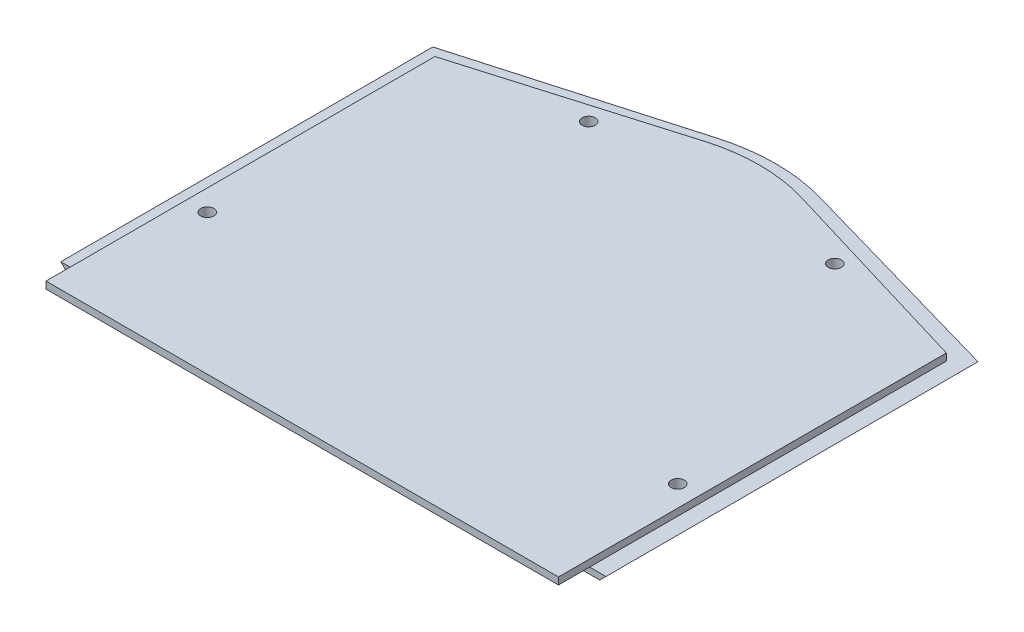
ISO-10303-21;
HEADER;
FILE_DESCRIPTION(('STEP AP214'),'2;1');
FILE_NAME('part.step','',(''),(''),'','','');
FILE_SCHEMA(('AUTOMOTIVE_DESIGN { 1 0 10303 214 1 1 1 1 }'));
ENDSEC;
DATA;
#1=APPLICATION_CONTEXT('core data for automotive mechanical design processes');
#2=APPLICATION_PROTOCOL_DEFINITION('international standard','automotive_design',2000,#1);
#3=PRODUCT_CONTEXT('',#1,'mechanical');
#4=PRODUCT('Part','Part','',(#3));
#5=PRODUCT_RELATED_PRODUCT_CATEGORY('part','',(#4));
#6=PRODUCT_DEFINITION_FORMATION('','',#4);
#7=PRODUCT_DEFINITION_CONTEXT('part definition',#1,'design');
#8=PRODUCT_DEFINITION('design','',#6,#7);
#9=PRODUCT_DEFINITION_SHAPE('','',#8);
#10=(LENGTH_UNIT() NAMED_UNIT(*) SI_UNIT(.MILLI.,.METRE.));
#11=(NAMED_UNIT(*) PLANE_ANGLE_UNIT() SI_UNIT($,.RADIAN.));
#12=(NAMED_UNIT(*) SI_UNIT($,.STERADIAN.) SOLID_ANGLE_UNIT());
#13=UNCERTAINTY_MEASURE_WITH_UNIT(LENGTH_MEASURE(1.E-05),#10,'distance_accuracy_value','');
#14=(GEOMETRIC_REPRESENTATION_CONTEXT(3) GLOBAL_UNCERTAINTY_ASSIGNED_CONTEXT((#13)) GLOBAL_UNIT_ASSIGNED_CONTEXT((#10,
#11,#12)) REPRESENTATION_CONTEXT('',''));
#15=CARTESIAN_POINT('',(0.,0.,0.));
#16=DIRECTION('',(0.,0.,1.));
#17=DIRECTION('',(1.,0.,0.));
#18=AXIS2_PLACEMENT_3D('',#15,#16,#17);
#19=CARTESIAN_POINT('',(-87.51,-2.,-9.99999999999999));
#20=DIRECTION('',(0.,0.,-1.));
#21=DIRECTION('',(0.,1.,0.));
#22=AXIS2_PLACEMENT_3D('',#19,#20,#21);
#23=PLANE('',#22);
#24=DIRECTION('',(0.70710678118654,-0.707106781186555,0.));
#25=VECTOR('',#24,1.);
#26=CARTESIAN_POINT('',(-85.5000000000001,-1.9999999999999,-9.99999999999999));
#27=LINE('',#26,#25);
#28=CARTESIAN_POINT('',(-87.5,0.,-9.99999999999998));
#29=VERTEX_POINT('',#28);
#30=CARTESIAN_POINT('',(-85.5,-2.,-9.99999999999999));
#31=VERTEX_POINT('',#30);
#32=EDGE_CURVE('E151',#29,#31,#27,.T.);
#33=ORIENTED_EDGE('',*,*,#32,.T.);
#34=DIRECTION('',(1.,0.,0.));
#35=VECTOR('',#34,1.);
#36=CARTESIAN_POINT('',(0.,-2.,-9.99999999999999));
#37=LINE('',#36,#35);
#38=CARTESIAN_POINT('',(85.5,-2.,-10.));
#39=VERTEX_POINT('',#38);
#40=EDGE_CURVE('E177',#31,#39,#37,.T.);
#41=ORIENTED_EDGE('',*,*,#40,.T.);
#42=DIRECTION('',(0.707106781186539,0.707106781186556,0.));
#43=VECTOR('',#42,1.);
#44=CARTESIAN_POINT('',(85.5000000000001,-1.9999999999999,-9.99999999999999));
#45=LINE('',#44,#43);
#46=CARTESIAN_POINT('',(87.5,0.,-9.99999999999999));
#47=VERTEX_POINT('',#46);
#48=EDGE_CURVE('E62',#39,#47,#45,.T.);
#49=ORIENTED_EDGE('',*,*,#48,.T.);
#50=DIRECTION('',(1.,0.,0.));
#51=VECTOR('',#50,1.);
#52=CARTESIAN_POINT('',(-87.51,0.,-10.));
#53=LINE('',#52,#51);
#54=CARTESIAN_POINT('',(82.2500000000001,0.,-9.99999999999995));
#55=VERTEX_POINT('',#54);
#56=EDGE_CURVE('E55',#55,#47,#53,.T.);
#57=ORIENTED_EDGE('',*,*,#56,.F.);
#58=CARTESIAN_POINT('',(-82.25,0.,-9.99999999999999));
#59=VERTEX_POINT('',#58);
#60=EDGE_CURVE('E191',#59,#55,#53,.T.);
#61=ORIENTED_EDGE('',*,*,#60,.F.);
#62=EDGE_CURVE('E185',#29,#59,#53,.T.);
#63=ORIENTED_EDGE('',*,*,#62,.F.);
#64=EDGE_LOOP('',(#33,#41,#49,#57,#61,#63));
#65=FACE_BOUND('',#64,.T.);
#66=ADVANCED_FACE('F39',(#65),#23,.F.);
#67=CARTESIAN_POINT('',(-87.51,0.,-10.));
#68=DIRECTION('',(0.,1.,0.));
#69=DIRECTION('',(0.,0.,1.));
#70=AXIS2_PLACEMENT_3D('',#67,#68,#69);
#71=PLANE('',#70);
#72=CARTESIAN_POINT('',(-72.2500000000001,0.,-4.99999999999995));
#73=DIRECTION('',(0.,1.,0.));
#74=DIRECTION('',(0.,0.,1.));
#75=AXIS2_PLACEMENT_3D('',#72,#73,#74);
#76=CIRCLE('',#75,2.25);
#77=CARTESIAN_POINT('',(-72.2500000000001,0.,-2.74999999999995));
#78=VERTEX_POINT('',#77);
#79=EDGE_CURVE('E205',#78,#78,#76,.F.);
#80=ORIENTED_EDGE('',*,*,#79,.F.);
#81=EDGE_LOOP('',(#80));
#82=FACE_BOUND('',#81,.T.);
#83=CARTESIAN_POINT('',(72.2500000000001,0.,-4.99999999999995));
#84=DIRECTION('',(0.,1.,0.));
#85=DIRECTION('',(0.,0.,1.));
#86=AXIS2_PLACEMENT_3D('',#83,#84,#85);
#87=CIRCLE('',#86,2.25);
#88=CARTESIAN_POINT('',(72.2500000000001,0.,-2.74999999999995));
#89=VERTEX_POINT('',#88);
#90=EDGE_CURVE('E190',#89,#89,#87,.F.);
#91=ORIENTED_EDGE('',*,*,#90,.F.);
#92=EDGE_LOOP('',(#91));
#93=FACE_BOUND('',#92,.T.);
#94=DIRECTION('',(0.,0.,-1.));
#95=VECTOR('',#94,1.);
#96=CARTESIAN_POINT('',(-82.25,0.,-124.813107271121));
#97=LINE('',#96,#95);
#98=CARTESIAN_POINT('',(-82.25,0.,0.));
#99=VERTEX_POINT('',#98);
#100=EDGE_CURVE('E491',#99,#59,#97,.T.);
#101=ORIENTED_EDGE('',*,*,#100,.T.);
#102=ORIENTED_EDGE('',*,*,#60,.T.);
#103=DIRECTION('',(0.,0.,1.));
#104=VECTOR('',#103,1.);
#105=CARTESIAN_POINT('',(82.25,0.,140.));
#106=LINE('',#105,#104);
#107=CARTESIAN_POINT('',(82.2500000000001,0.,0.));
#108=VERTEX_POINT('',#107);
#109=EDGE_CURVE('E176',#55,#108,#106,.T.);
#110=ORIENTED_EDGE('',*,*,#109,.T.);
#111=DIRECTION('',(1.,0.,0.));
#112=VECTOR('',#111,1.);
#113=CARTESIAN_POINT('',(-87.51,0.,0.));
#114=LINE('',#113,#112);
#115=EDGE_CURVE('E186',#99,#108,#114,.T.);
#116=ORIENTED_EDGE('',*,*,#115,.F.);
#117=EDGE_LOOP('',(#101,#102,#110,#116));
#118=FACE_BOUND('',#117,.T.);
#119=ADVANCED_FACE('F232',(#82,#93,#118),#71,.F.);
#120=CARTESIAN_POINT('',(-87.51,0.,0.));
#121=DIRECTION('',(0.,0.,-1.));
#122=DIRECTION('',(0.,1.,0.));
#123=AXIS2_PLACEMENT_3D('',#120,#121,#122);
#124=PLANE('',#123);
#125=DIRECTION('',(0.,1.,0.));
#126=VECTOR('',#125,1.);
#127=CARTESIAN_POINT('',(82.2500000000001,2.24999999999914,0.));
#128=LINE('',#127,#126);
#129=CARTESIAN_POINT('',(82.2500000000001,2.25,0.));
#130=VERTEX_POINT('',#129);
#131=EDGE_CURVE('E184',#108,#130,#128,.T.);
#132=ORIENTED_EDGE('',*,*,#131,.T.);
#133=DIRECTION('',(1.,0.,0.));
#134=VECTOR('',#133,1.);
#135=CARTESIAN_POINT('',(-0.000440445540175055,2.25,0.));
#136=LINE('',#135,#134);
#137=CARTESIAN_POINT('',(-82.25,2.25,0.));
#138=VERTEX_POINT('',#137);
#139=EDGE_CURVE('E181',#138,#130,#136,.T.);
#140=ORIENTED_EDGE('',*,*,#139,.F.);
#141=DIRECTION('',(0.,-1.,0.));
#142=VECTOR('',#141,1.);
#143=CARTESIAN_POINT('',(-82.25,2.25000000000077,0.));
#144=LINE('',#143,#142);
#145=EDGE_CURVE('E180',#138,#99,#144,.T.);
#146=ORIENTED_EDGE('',*,*,#145,.T.);
#147=ORIENTED_EDGE('',*,*,#115,.T.);
#148=EDGE_LOOP('',(#132,#140,#146,#147));
#149=FACE_BOUND('',#148,.T.);
#150=ADVANCED_FACE('F238',(#149),#124,.F.);
#151=CARTESIAN_POINT('',(-0.000440445540175055,2.25,-91.9949855904792));
#152=DIRECTION('',(0.,-1.,0.));
#153=DIRECTION('',(0.,0.,-1.));
#154=AXIS2_PLACEMENT_3D('',#151,#152,#153);
#155=PLANE('',#154);
#156=CARTESIAN_POINT('',(75.5,2.25,-45.018802153517));
#157=DIRECTION('',(0.,-1.,0.));
#158=DIRECTION('',(0.,0.,-1.));
#159=AXIS2_PLACEMENT_3D('',#156,#157,#158);
#160=CIRCLE('',#159,2.1);
#161=CARTESIAN_POINT('',(75.5,2.25,-47.118802153517));
#162=VERTEX_POINT('',#161);
#163=EDGE_CURVE('E618',#162,#162,#160,.F.);
#164=ORIENTED_EDGE('',*,*,#163,.F.);
#165=EDGE_LOOP('',(#164));
#166=FACE_BOUND('',#165,.T.);
#167=CARTESIAN_POINT('',(-75.5,2.25,-45.018802153517));
#168=DIRECTION('',(0.,-1.,0.));
#169=DIRECTION('',(0.,0.,-1.));
#170=AXIS2_PLACEMENT_3D('',#167,#168,#169);
#171=CIRCLE('',#170,2.1);
#172=CARTESIAN_POINT('',(-75.5,2.25,-47.118802153517));
#173=VERTEX_POINT('',#172);
#174=EDGE_CURVE('E626',#173,#173,#171,.F.);
#175=ORIENTED_EDGE('',*,*,#174,.F.);
#176=EDGE_LOOP('',(#175));
#177=FACE_BOUND('',#176,.T.);
#178=CARTESIAN_POINT('',(-39.4999999999999,2.25,-131.431881025172));
#179=DIRECTION('',(0.,-1.,0.));
#180=DIRECTION('',(0.,0.,-1.));
#181=AXIS2_PLACEMENT_3D('',#178,#179,#180);
#182=CIRCLE('',#181,2.09999999999999);
#183=CARTESIAN_POINT('',(-39.4999999999999,2.25,-133.531881025172));
#184=VERTEX_POINT('',#183);
#185=EDGE_CURVE('E627',#184,#184,#182,.F.);
#186=ORIENTED_EDGE('',*,*,#185,.F.);
#187=EDGE_LOOP('',(#186));
#188=FACE_BOUND('',#187,.T.);
#189=CARTESIAN_POINT('',(39.4999999999999,2.25,-131.431881025172));
#190=DIRECTION('',(0.,-1.,0.));
#191=DIRECTION('',(0.,0.,-1.));
#192=AXIS2_PLACEMENT_3D('',#189,#190,#191);
#193=CIRCLE('',#192,2.09999999999999);
#194=CARTESIAN_POINT('',(39.4999999999999,2.25,-133.531881025172));
#195=VERTEX_POINT('',#194);
#196=EDGE_CURVE('E562',#195,#195,#193,.F.);
#197=ORIENTED_EDGE('',*,*,#196,.F.);
#198=EDGE_LOOP('',(#197));
#199=FACE_BOUND('',#198,.T.);
#200=DIRECTION('',(0.,0.,-1.));
#201=VECTOR('',#200,1.);
#202=CARTESIAN_POINT('',(-82.25,2.25,-124.813107271121));
#203=LINE('',#202,#201);
#204=CARTESIAN_POINT('',(-82.25,2.25,-124.813107271121));
#205=VERTEX_POINT('',#204);
#206=EDGE_CURVE('E529',#138,#205,#203,.T.);
#207=ORIENTED_EDGE('',*,*,#206,.F.);
#208=ORIENTED_EDGE('',*,*,#139,.T.);
#209=DIRECTION('',(0.,0.,1.));
#210=VECTOR('',#209,1.);
#211=CARTESIAN_POINT('',(82.25,2.25,140.));
#212=LINE('',#211,#210);
#213=CARTESIAN_POINT('',(82.2500000000001,2.25,-124.502754063605));
#214=VERTEX_POINT('',#213);
#215=EDGE_CURVE('E512',#214,#130,#212,.T.);
#216=ORIENTED_EDGE('',*,*,#215,.F.);
#217=DIRECTION('',(0.957804935689602,0.,0.287419041068329));
#218=VECTOR('',#217,1.);
#219=CARTESIAN_POINT('',(82.2500000000001,2.25,-124.502754063605));
#220=LINE('',#219,#218);
#221=CARTESIAN_POINT('',(15.1801210419452,2.25,-144.629148881997));
#222=VERTEX_POINT('',#221);
#223=EDGE_CURVE('E588',#222,#214,#220,.T.);
#224=ORIENTED_EDGE('',*,*,#223,.F.);
#225=CARTESIAN_POINT('',(0.0927899102311189,2.25,-91.9949855904792));
#226=DIRECTION('',(0.,-1.,0.));
#227=DIRECTION('',(0.,0.,-1.));
#228=AXIS2_PLACEMENT_3D('',#225,#226,#227);
#229=CIRCLE('',#228,54.7538373639337);
#230=CARTESIAN_POINT('',(0.0461747323373077,2.25,-146.748803111281));
#231=VERTEX_POINT('',#230);
#232=EDGE_CURVE('E585',#231,#222,#229,.T.);
#233=ORIENTED_EDGE('',*,*,#232,.F.);
#234=CARTESIAN_POINT('',(-0.000440445540175055,2.25,-91.9949855904792));
#235=DIRECTION('',(0.,-1.,0.));
#236=DIRECTION('',(0.,0.,-1.));
#237=AXIS2_PLACEMENT_3D('',#234,#235,#236);
#238=CIRCLE('',#237,54.7538373639337);
#239=CARTESIAN_POINT('',(-15.0877715772482,2.25,-144.629148881998));
#240=VERTEX_POINT('',#239);
#241=EDGE_CURVE('E581',#240,#231,#238,.T.);
#242=ORIENTED_EDGE('',*,*,#241,.F.);
#243=DIRECTION('',(0.959123750848793,0.,-0.282986979484468));
#244=VECTOR('',#243,1.);
#245=CARTESIAN_POINT('',(-15.0877715772482,2.25,-144.629148881998));
#246=LINE('',#245,#244);
#247=EDGE_CURVE('E577',#205,#240,#246,.T.);
#248=ORIENTED_EDGE('',*,*,#247,.F.);
#249=EDGE_LOOP('',(#207,#208,#216,#224,#233,#242,#248));
#250=FACE_BOUND('',#249,.T.);
#251=ADVANCED_FACE('F244',(#166,#177,#188,#199,#250),#155,.F.);
#252=CARTESIAN_POINT('',(82.25,2.25,140.));
#253=DIRECTION('',(1.,0.,0.));
#254=DIRECTION('',(0.,0.,-1.));
#255=AXIS2_PLACEMENT_3D('',#252,#253,#254);
#256=PLANE('',#255);
#257=ORIENTED_EDGE('',*,*,#131,.F.);
#258=ORIENTED_EDGE('',*,*,#109,.F.);
#259=CARTESIAN_POINT('',(82.2500000000001,0.,-124.502754063605));
#260=VERTEX_POINT('',#259);
#261=EDGE_CURVE('E526',#260,#55,#106,.T.);
#262=ORIENTED_EDGE('',*,*,#261,.F.);
#263=DIRECTION('',(0.,-1.,0.));
#264=VECTOR('',#263,1.);
#265=CARTESIAN_POINT('',(82.2500000000001,2.25,-124.502754063605));
#266=LINE('',#265,#264);
#267=EDGE_CURVE('E530',#214,#260,#266,.T.);
#268=ORIENTED_EDGE('',*,*,#267,.F.);
#269=ORIENTED_EDGE('',*,*,#215,.T.);
#270=EDGE_LOOP('',(#257,#258,#262,#268,#269));
#271=FACE_BOUND('',#270,.T.);
#272=ADVANCED_FACE('F284',(#271),#256,.T.);
#273=CARTESIAN_POINT('',(82.2500000000001,2.25,-124.502754063605));
#274=DIRECTION('',(0.287419041068329,0.,-0.957804935689602));
#275=DIRECTION('',(-0.957804935689602,0.,-0.287419041068329));
#276=AXIS2_PLACEMENT_3D('',#273,#274,#275);
#277=PLANE('',#276);
#278=DIRECTION('',(0.957804935689602,0.,0.287419041068329));
#279=VECTOR('',#278,1.);
#280=CARTESIAN_POINT('',(82.2500000000001,0.,-124.502754063605));
#281=LINE('',#280,#279);
#282=CARTESIAN_POINT('',(15.1801210419452,0.,-144.629148881997));
#283=VERTEX_POINT('',#282);
#284=EDGE_CURVE('E522',#283,#260,#281,.T.);
#285=ORIENTED_EDGE('',*,*,#284,.F.);
#286=DIRECTION('',(0.,-1.,0.));
#287=VECTOR('',#286,1.);
#288=CARTESIAN_POINT('',(15.1801210419452,2.25,-144.629148881997));
#289=LINE('',#288,#287);
#290=EDGE_CURVE('E534',#222,#283,#289,.T.);
#291=ORIENTED_EDGE('',*,*,#290,.F.);
#292=ORIENTED_EDGE('',*,*,#223,.T.);
#293=ORIENTED_EDGE('',*,*,#267,.T.);
#294=EDGE_LOOP('',(#285,#291,#292,#293));
#295=FACE_BOUND('',#294,.T.);
#296=ADVANCED_FACE('F280',(#295),#277,.T.);
#297=CARTESIAN_POINT('',(0.0927899102311189,2.25,-91.9949855904792));
#298=DIRECTION('',(0.,-1.,0.));
#299=DIRECTION('',(0.,0.,-1.));
#300=AXIS2_PLACEMENT_3D('',#297,#298,#299);
#301=CYLINDRICAL_SURFACE('',#300,54.7538373639337);
#302=CARTESIAN_POINT('',(0.0927899102311189,0.,-91.9949855904792));
#303=DIRECTION('',(0.,-1.,0.));
#304=DIRECTION('',(0.,0.,-1.));
#305=AXIS2_PLACEMENT_3D('',#302,#303,#304);
#306=CIRCLE('',#305,54.7538373639337);
#307=CARTESIAN_POINT('',(0.0461747323373077,0.,-146.748803111281));
#308=VERTEX_POINT('',#307);
#309=EDGE_CURVE('E518',#308,#283,#306,.T.);
#310=ORIENTED_EDGE('',*,*,#309,.F.);
#311=DIRECTION('',(0.,-1.,0.));
#312=VECTOR('',#311,1.);
#313=CARTESIAN_POINT('',(0.0461747323373077,2.25,-146.748803111281));
#314=LINE('',#313,#312);
#315=EDGE_CURVE('E537',#231,#308,#314,.T.);
#316=ORIENTED_EDGE('',*,*,#315,.F.);
#317=ORIENTED_EDGE('',*,*,#232,.T.);
#318=ORIENTED_EDGE('',*,*,#290,.T.);
#319=EDGE_LOOP('',(#310,#316,#317,#318));
#320=FACE_BOUND('',#319,.T.);
#321=ADVANCED_FACE('F276',(#320),#301,.T.);
#322=CARTESIAN_POINT('',(-0.000440445540175055,2.25,-91.9949855904792));
#323=DIRECTION('',(0.,-1.,0.));
#324=DIRECTION('',(0.,0.,-1.));
#325=AXIS2_PLACEMENT_3D('',#322,#323,#324);
#326=CYLINDRICAL_SURFACE('',#325,54.7538373639337);
#327=CARTESIAN_POINT('',(-0.000440445540175055,0.,-91.9949855904792));
#328=DIRECTION('',(0.,-1.,0.));
#329=DIRECTION('',(0.,0.,-1.));
#330=AXIS2_PLACEMENT_3D('',#327,#328,#329);
#331=CIRCLE('',#330,54.7538373639337);
#332=CARTESIAN_POINT('',(-15.0877715772482,0.,-144.629148881998));
#333=VERTEX_POINT('',#332);
#334=EDGE_CURVE('E507',#333,#308,#331,.T.);
#335=ORIENTED_EDGE('',*,*,#334,.F.);
#336=DIRECTION('',(0.,-1.,0.));
#337=VECTOR('',#336,1.);
#338=CARTESIAN_POINT('',(-15.0877715772482,2.25,-144.629148881998));
#339=LINE('',#338,#337);
#340=EDGE_CURVE('E540',#240,#333,#339,.T.);
#341=ORIENTED_EDGE('',*,*,#340,.F.);
#342=ORIENTED_EDGE('',*,*,#241,.T.);
#343=ORIENTED_EDGE('',*,*,#315,.T.);
#344=EDGE_LOOP('',(#335,#341,#342,#343));
#345=FACE_BOUND('',#344,.T.);
#346=ADVANCED_FACE('F272',(#345),#326,.T.);
#347=CARTESIAN_POINT('',(-15.0877715772482,2.25,-144.629148881998));
#348=DIRECTION('',(-0.282986979484468,0.,-0.959123750848793));
#349=DIRECTION('',(-0.959123750848793,0.,0.282986979484468));
#350=AXIS2_PLACEMENT_3D('',#347,#348,#349);
#351=PLANE('',#350);
#352=DIRECTION('',(0.959123750848793,0.,-0.282986979484468));
#353=VECTOR('',#352,1.);
#354=CARTESIAN_POINT('',(-15.0877715772482,0.,-144.629148881998));
#355=LINE('',#354,#353);
#356=CARTESIAN_POINT('',(-82.25,0.,-124.813107271121));
#357=VERTEX_POINT('',#356);
#358=EDGE_CURVE('E503',#357,#333,#355,.T.);
#359=ORIENTED_EDGE('',*,*,#358,.F.);
#360=DIRECTION('',(0.,-1.,0.));
#361=VECTOR('',#360,1.);
#362=CARTESIAN_POINT('',(-82.25,2.25,-124.813107271121));
#363=LINE('',#362,#361);
#364=EDGE_CURVE('E499',#205,#357,#363,.T.);
#365=ORIENTED_EDGE('',*,*,#364,.F.);
#366=ORIENTED_EDGE('',*,*,#247,.T.);
#367=ORIENTED_EDGE('',*,*,#340,.T.);
#368=EDGE_LOOP('',(#359,#365,#366,#367));
#369=FACE_BOUND('',#368,.T.);
#370=ADVANCED_FACE('F268',(#369),#351,.T.);
#371=CARTESIAN_POINT('',(-82.25,2.25,-124.813107271121));
#372=DIRECTION('',(-1.,0.,0.));
#373=DIRECTION('',(0.,0.,1.));
#374=AXIS2_PLACEMENT_3D('',#371,#372,#373);
#375=PLANE('',#374);
#376=ORIENTED_EDGE('',*,*,#145,.F.);
#377=ORIENTED_EDGE('',*,*,#206,.T.);
#378=ORIENTED_EDGE('',*,*,#364,.T.);
#379=EDGE_CURVE('E496',#59,#357,#97,.T.);
#380=ORIENTED_EDGE('',*,*,#379,.F.);
#381=ORIENTED_EDGE('',*,*,#100,.F.);
#382=EDGE_LOOP('',(#376,#377,#378,#380,#381));
#383=FACE_BOUND('',#382,.T.);
#384=ADVANCED_FACE('F264',(#383),#375,.T.);
#385=CARTESIAN_POINT('',(39.4999999999999,2.251,-131.431881025172));
#386=DIRECTION('',(0.,-1.,0.));
#387=DIRECTION('',(0.,0.,-1.));
#388=AXIS2_PLACEMENT_3D('',#385,#386,#387);
#389=CYLINDRICAL_SURFACE('',#388,2.09999999999999);
#390=CARTESIAN_POINT('',(39.4999999999999,-2.,-131.431881025172));
#391=DIRECTION('',(0.,-1.,0.));
#392=DIRECTION('',(0.,0.,-1.));
#393=AXIS2_PLACEMENT_3D('',#390,#391,#392);
#394=CIRCLE('',#393,2.09999999999999);
#395=CARTESIAN_POINT('',(39.4999999999999,-2.,-133.531881025172));
#396=VERTEX_POINT('',#395);
#397=EDGE_CURVE('E614',#396,#396,#394,.T.);
#398=ORIENTED_EDGE('',*,*,#397,.T.);
#399=EDGE_LOOP('',(#398));
#400=FACE_BOUND('',#399,.T.);
#401=ORIENTED_EDGE('',*,*,#196,.T.);
#402=EDGE_LOOP('',(#401));
#403=FACE_BOUND('',#402,.T.);
#404=ADVANCED_FACE('F267',(#400,#403),#389,.F.);
#405=CARTESIAN_POINT('',(-39.4999999999999,2.251,-131.431881025172));
#406=DIRECTION('',(0.,-1.,0.));
#407=DIRECTION('',(0.,0.,-1.));
#408=AXIS2_PLACEMENT_3D('',#405,#406,#407);
#409=CYLINDRICAL_SURFACE('',#408,2.09999999999999);
#410=CARTESIAN_POINT('',(-39.4999999999999,-2.,-131.431881025172));
#411=DIRECTION('',(0.,-1.,0.));
#412=DIRECTION('',(0.,0.,1.));
#413=AXIS2_PLACEMENT_3D('',#410,#411,#412);
#414=CIRCLE('',#413,2.09999999999999);
#415=CARTESIAN_POINT('',(-39.4999999999999,-2.,-129.331881025172));
#416=VERTEX_POINT('',#415);
#417=EDGE_CURVE('E632',#416,#416,#414,.T.);
#418=ORIENTED_EDGE('',*,*,#417,.T.);
#419=EDGE_LOOP('',(#418));
#420=FACE_BOUND('',#419,.T.);
#421=ORIENTED_EDGE('',*,*,#185,.T.);
#422=EDGE_LOOP('',(#421));
#423=FACE_BOUND('',#422,.T.);
#424=ADVANCED_FACE('F299',(#420,#423),#409,.F.);
#425=CARTESIAN_POINT('',(-75.5,2.251,-45.018802153517));
#426=DIRECTION('',(0.,-1.,0.));
#427=DIRECTION('',(0.,0.,-1.));
#428=AXIS2_PLACEMENT_3D('',#425,#426,#427);
#429=CYLINDRICAL_SURFACE('',#428,2.1);
#430=CARTESIAN_POINT('',(-75.5,-2.,-45.018802153517));
#431=DIRECTION('',(0.,-1.,0.));
#432=DIRECTION('',(0.,0.,1.));
#433=AXIS2_PLACEMENT_3D('',#430,#431,#432);
#434=CIRCLE('',#433,2.1);
#435=CARTESIAN_POINT('',(-75.5,-2.,-42.918802153517));
#436=VERTEX_POINT('',#435);
#437=EDGE_CURVE('E631',#436,#436,#434,.T.);
#438=ORIENTED_EDGE('',*,*,#437,.T.);
#439=EDGE_LOOP('',(#438));
#440=FACE_BOUND('',#439,.T.);
#441=ORIENTED_EDGE('',*,*,#174,.T.);
#442=EDGE_LOOP('',(#441));
#443=FACE_BOUND('',#442,.T.);
#444=ADVANCED_FACE('F303',(#440,#443),#429,.F.);
#445=CARTESIAN_POINT('',(75.5,2.251,-45.018802153517));
#446=DIRECTION('',(0.,-1.,0.));
#447=DIRECTION('',(0.,0.,-1.));
#448=AXIS2_PLACEMENT_3D('',#445,#446,#447);
#449=CYLINDRICAL_SURFACE('',#448,2.1);
#450=CARTESIAN_POINT('',(75.5,-2.,-45.018802153517));
#451=DIRECTION('',(0.,-1.,0.));
#452=DIRECTION('',(0.,0.,-1.));
#453=AXIS2_PLACEMENT_3D('',#450,#451,#452);
#454=CIRCLE('',#453,2.1);
#455=CARTESIAN_POINT('',(75.5,-2.,-47.118802153517));
#456=VERTEX_POINT('',#455);
#457=EDGE_CURVE('E622',#456,#456,#454,.T.);
#458=ORIENTED_EDGE('',*,*,#457,.T.);
#459=EDGE_LOOP('',(#458));
#460=FACE_BOUND('',#459,.T.);
#461=ORIENTED_EDGE('',*,*,#163,.T.);
#462=EDGE_LOOP('',(#461));
#463=FACE_BOUND('',#462,.T.);
#464=ADVANCED_FACE('F255',(#460,#463),#449,.F.);
#465=CARTESIAN_POINT('',(0.,-2.,-91.9988226148516));
#466=DIRECTION('',(0.,1.,0.));
#467=DIRECTION('',(0.,0.,1.));
#468=AXIS2_PLACEMENT_3D('',#465,#466,#467);
#469=CONICAL_SURFACE('',#468,58.,0.785398163397436);
#470=DIRECTION('',(-0.194257172471451,0.707106781186559,-0.679900103650073));
#471=VECTOR('',#470,1.);
#472=CARTESIAN_POINT('',(-15.933825418048,-2.,-147.767211578019));
#473=LINE('',#472,#471);
#474=CARTESIAN_POINT('',(-15.933825418048,-2.,-147.767211578019));
#475=VERTEX_POINT('',#474);
#476=CARTESIAN_POINT('',(-16.4832676738427,0.,-149.690259473301));
#477=VERTEX_POINT('',#476);
#478=EDGE_CURVE('E167',#475,#477,#473,.T.);
#479=ORIENTED_EDGE('',*,*,#478,.T.);
#480=CARTESIAN_POINT('',(0.,0.,-91.9988226148516));
#481=DIRECTION('',(0.,-1.,0.));
#482=DIRECTION('',(0.,0.,-1.));
#483=AXIS2_PLACEMENT_3D('',#480,#481,#482);
#484=CIRCLE('',#483,60.);
#485=CARTESIAN_POINT('',(16.4832676738426,0.,-149.690259473301));
#486=VERTEX_POINT('',#485);
#487=EDGE_CURVE('E158',#477,#486,#484,.T.);
#488=ORIENTED_EDGE('',*,*,#487,.T.);
#489=DIRECTION('',(0.194257172471452,0.707106781186554,-0.679900103650078));
#490=VECTOR('',#489,1.);
#491=CARTESIAN_POINT('',(15.9338254180479,-2.,-147.767211578019));
#492=LINE('',#491,#490);
#493=CARTESIAN_POINT('',(15.9338254180479,-2.,-147.767211578019));
#494=VERTEX_POINT('',#493);
#495=EDGE_CURVE('E170',#494,#486,#492,.T.);
#496=ORIENTED_EDGE('',*,*,#495,.F.);
#497=CARTESIAN_POINT('',(0.,-2.,-91.9988226148516));
#498=DIRECTION('',(0.,-1.,0.));
#499=DIRECTION('',(0.,0.,-1.));
#500=AXIS2_PLACEMENT_3D('',#497,#498,#499);
#501=CIRCLE('',#500,58.);
#502=EDGE_CURVE('E549',#475,#494,#501,.T.);
#503=ORIENTED_EDGE('',*,*,#502,.F.);
#504=EDGE_LOOP('',(#479,#488,#496,#503));
#505=FACE_BOUND('',#504,.T.);
#506=ADVANCED_FACE('F252',(#505),#469,.T.);
#507=CARTESIAN_POINT('',(-15.9338254180479,-2.,-147.767211578019));
#508=DIRECTION('',(-0.194257172471456,-0.707106781186536,-0.679900103650096));
#509=DIRECTION('',(-0.961523947640823,0.,0.274721127897378));
#510=AXIS2_PLACEMENT_3D('',#507,#508,#509);
#511=PLANE('',#510);
#512=DIRECTION('',(0.62390782298312,-0.623907822983133,0.470614552304656));
#513=VECTOR('',#512,1.);
#514=CARTESIAN_POINT('',(-74.9612877808828,-12.5387122191174,-119.94179618197));
#515=LINE('',#514,#513);
#516=CARTESIAN_POINT('',(-85.5,-2.,-127.891161697462));
#517=VERTEX_POINT('',#516);
#518=CARTESIAN_POINT('',(-87.5,0.,-129.39976452297));
#519=VERTEX_POINT('',#518);
#520=EDGE_CURVE('E148',#517,#519,#515,.F.);
#521=ORIENTED_EDGE('',*,*,#520,.T.);
#522=DIRECTION('',(0.961523947640823,0.,-0.274721127897378));
#523=VECTOR('',#522,1.);
#524=CARTESIAN_POINT('',(-87.5,0.,-129.39976452297));
#525=LINE('',#524,#523);
#526=EDGE_CURVE('E153',#519,#477,#525,.T.);
#527=ORIENTED_EDGE('',*,*,#526,.T.);
#528=ORIENTED_EDGE('',*,*,#478,.F.);
#529=DIRECTION('',(0.961523947640823,0.,-0.274721127897378));
#530=VECTOR('',#529,1.);
#531=CARTESIAN_POINT('',(-15.933825418048,-2.,-147.767211578019));
#532=LINE('',#531,#530);
#533=EDGE_CURVE('E165',#517,#475,#532,.T.);
#534=ORIENTED_EDGE('',*,*,#533,.F.);
#535=EDGE_LOOP('',(#521,#527,#528,#534));
#536=FACE_BOUND('',#535,.T.);
#537=ADVANCED_FACE('F164',(#536),#511,.T.);
#538=CARTESIAN_POINT('',(0.,0.,-91.9988226148516));
#539=DIRECTION('',(0.,-1.,0.));
#540=DIRECTION('',(0.,0.,-1.));
#541=AXIS2_PLACEMENT_3D('',#538,#539,#540);
#542=PLANE('',#541);
#543=DIRECTION('',(0.,0.,-1.));
#544=VECTOR('',#543,1.);
#545=CARTESIAN_POINT('',(-87.5,0.,140.));
#546=LINE('',#545,#544);
#547=EDGE_CURVE('E143',#29,#519,#546,.T.);
#548=ORIENTED_EDGE('',*,*,#547,.F.);
#549=ORIENTED_EDGE('',*,*,#62,.T.);
#550=ORIENTED_EDGE('',*,*,#379,.T.);
#551=ORIENTED_EDGE('',*,*,#358,.T.);
#552=ORIENTED_EDGE('',*,*,#334,.T.);
#553=ORIENTED_EDGE('',*,*,#309,.T.);
#554=ORIENTED_EDGE('',*,*,#284,.T.);
#555=ORIENTED_EDGE('',*,*,#261,.T.);
#556=ORIENTED_EDGE('',*,*,#56,.T.);
#557=DIRECTION('',(0.,0.,1.));
#558=VECTOR('',#557,1.);
#559=CARTESIAN_POINT('',(87.5,0.,-129.39976452297));
#560=LINE('',#559,#558);
#561=CARTESIAN_POINT('',(87.5,0.,-129.39976452297));
#562=VERTEX_POINT('',#561);
#563=EDGE_CURVE('E504',#562,#47,#560,.T.);
#564=ORIENTED_EDGE('',*,*,#563,.F.);
#565=DIRECTION('',(0.961523947640823,0.,0.274721127897378));
#566=VECTOR('',#565,1.);
#567=CARTESIAN_POINT('',(16.4832676738426,0.,-149.690259473301));
#568=LINE('',#567,#566);
#569=EDGE_CURVE('E509',#486,#562,#568,.T.);
#570=ORIENTED_EDGE('',*,*,#569,.F.);
#571=ORIENTED_EDGE('',*,*,#487,.F.);
#572=ORIENTED_EDGE('',*,*,#526,.F.);
#573=EDGE_LOOP('',(#548,#549,#550,#551,#552,#553,#554,#555,#556,#564,#570,#571,#572));
#574=FACE_BOUND('',#573,.T.);
#575=ADVANCED_FACE('F156',(#574),#542,.F.);
#576=CARTESIAN_POINT('',(15.9338254180479,-2.,-147.767211578019));
#577=DIRECTION('',(0.194257172471455,-0.707106781186538,-0.679900103650094));
#578=DIRECTION('',(-0.961523947640823,0.,-0.274721127897378));
#579=AXIS2_PLACEMENT_3D('',#576,#577,#578);
#580=PLANE('',#579);
#581=ORIENTED_EDGE('',*,*,#495,.T.);
#582=ORIENTED_EDGE('',*,*,#569,.T.);
#583=DIRECTION('',(-0.623907822983117,-0.623907822983133,0.47061455230466));
#584=VECTOR('',#583,1.);
#585=CARTESIAN_POINT('',(64.2566110624456,-23.2433889375549,-111.867243410174));
#586=LINE('',#585,#584);
#587=CARTESIAN_POINT('',(85.5,-2.,-127.891161697462));
#588=VERTEX_POINT('',#587);
#589=EDGE_CURVE('E559',#588,#562,#586,.F.);
#590=ORIENTED_EDGE('',*,*,#589,.F.);
#591=DIRECTION('',(0.961523947640823,0.,0.274721127897378));
#592=VECTOR('',#591,1.);
#593=CARTESIAN_POINT('',(86.9505577442052,-2.,-127.476716627689));
#594=LINE('',#593,#592);
#595=EDGE_CURVE('E552',#494,#588,#594,.T.);
#596=ORIENTED_EDGE('',*,*,#595,.F.);
#597=EDGE_LOOP('',(#581,#582,#590,#596));
#598=FACE_BOUND('',#597,.T.);
#599=ADVANCED_FACE('F257',(#598),#580,.T.);
#600=CARTESIAN_POINT('',(0.,-2.,-91.9988226148516));
#601=DIRECTION('',(0.,-1.,0.));
#602=DIRECTION('',(0.,0.,-1.));
#603=AXIS2_PLACEMENT_3D('',#600,#601,#602);
#604=PLANE('',#603);
#605=ORIENTED_EDGE('',*,*,#40,.F.);
#606=DIRECTION('',(0.,0.,-1.));
#607=VECTOR('',#606,1.);
#608=CARTESIAN_POINT('',(-85.5,-2.,-129.39976452297));
#609=LINE('',#608,#607);
#610=EDGE_CURVE('E533',#31,#517,#609,.T.);
#611=ORIENTED_EDGE('',*,*,#610,.T.);
#612=ORIENTED_EDGE('',*,*,#533,.T.);
#613=ORIENTED_EDGE('',*,*,#502,.T.);
#614=ORIENTED_EDGE('',*,*,#595,.T.);
#615=DIRECTION('',(0.,0.,1.));
#616=VECTOR('',#615,1.);
#617=CARTESIAN_POINT('',(85.5,-2.,140.));
#618=LINE('',#617,#616);
#619=EDGE_CURVE('E555',#588,#39,#618,.T.);
#620=ORIENTED_EDGE('',*,*,#619,.T.);
#621=EDGE_LOOP('',(#605,#611,#612,#613,#614,#620));
#622=FACE_BOUND('',#621,.T.);
#623=ORIENTED_EDGE('',*,*,#457,.F.);
#624=EDGE_LOOP('',(#623));
#625=FACE_BOUND('',#624,.T.);
#626=ORIENTED_EDGE('',*,*,#437,.F.);
#627=EDGE_LOOP('',(#626));
#628=FACE_BOUND('',#627,.T.);
#629=ORIENTED_EDGE('',*,*,#417,.F.);
#630=EDGE_LOOP('',(#629));
#631=FACE_BOUND('',#630,.T.);
#632=ORIENTED_EDGE('',*,*,#397,.F.);
#633=EDGE_LOOP('',(#632));
#634=FACE_BOUND('',#633,.T.);
#635=ADVANCED_FACE('F260',(#622,#625,#628,#631,#634),#604,.T.);
#636=CARTESIAN_POINT('',(85.5,-2.,-91.9988226148516));
#637=DIRECTION('',(0.707106781186556,-0.707106781186539,0.));
#638=DIRECTION('',(0.,0.,-1.));
#639=AXIS2_PLACEMENT_3D('',#636,#637,#638);
#640=PLANE('',#639);
#641=ORIENTED_EDGE('',*,*,#48,.F.);
#642=ORIENTED_EDGE('',*,*,#619,.F.);
#643=ORIENTED_EDGE('',*,*,#589,.T.);
#644=ORIENTED_EDGE('',*,*,#563,.T.);
#645=EDGE_LOOP('',(#641,#642,#643,#644));
#646=FACE_BOUND('',#645,.T.);
#647=ADVANCED_FACE('F249',(#646),#640,.T.);
#648=CARTESIAN_POINT('',(-85.5,-2.,-91.9988226148516));
#649=DIRECTION('',(-0.707106781186555,-0.70710678118654,0.));
#650=DIRECTION('',(0.,0.,1.));
#651=AXIS2_PLACEMENT_3D('',#648,#649,#650);
#652=PLANE('',#651);
#653=ORIENTED_EDGE('',*,*,#32,.F.);
#654=ORIENTED_EDGE('',*,*,#547,.T.);
#655=ORIENTED_EDGE('',*,*,#520,.F.);
#656=ORIENTED_EDGE('',*,*,#610,.F.);
#657=EDGE_LOOP('',(#653,#654,#655,#656));
#658=FACE_BOUND('',#657,.T.);
#659=ADVANCED_FACE('F145',(#658),#652,.T.);
#660=CARTESIAN_POINT('',(72.2500000000001,-2.,-4.99999999999995));
#661=DIRECTION('',(0.,1.,0.));
#662=DIRECTION('',(0.,0.,1.));
#663=AXIS2_PLACEMENT_3D('',#660,#661,#662);
#664=CYLINDRICAL_SURFACE('',#663,2.25);
#665=CARTESIAN_POINT('',(72.2500000000001,-1.75,-4.99999999999995));
#666=DIRECTION('',(0.,-1.,0.));
#667=DIRECTION('',(0.,0.,-1.));
#668=AXIS2_PLACEMENT_3D('',#665,#666,#667);
#669=CIRCLE('',#668,2.25);
#670=CARTESIAN_POINT('',(72.2500000000001,-1.75,-7.24999999999994));
#671=VERTEX_POINT('',#670);
#672=EDGE_CURVE('E11',#671,#671,#669,.F.);
#673=ORIENTED_EDGE('',*,*,#672,.T.);
#674=EDGE_LOOP('',(#673));
#675=FACE_BOUND('',#674,.T.);
#676=ORIENTED_EDGE('',*,*,#90,.T.);
#677=EDGE_LOOP('',(#676));
#678=FACE_BOUND('',#677,.T.);
#679=ADVANCED_FACE('F248',(#675,#678),#664,.T.);
#680=CARTESIAN_POINT('',(72.2500000000001,-2.,-4.99999999999995));
#681=DIRECTION('',(0.,-1.,0.));
#682=DIRECTION('',(0.,0.,-1.));
#683=AXIS2_PLACEMENT_3D('',#680,#681,#682);
#684=PLANE('',#683);
#685=CARTESIAN_POINT('',(72.2500000000001,-2.,-4.99999999999995));
#686=DIRECTION('',(0.,-1.,0.));
#687=DIRECTION('',(0.,0.,-1.));
#688=AXIS2_PLACEMENT_3D('',#685,#686,#687);
#689=CIRCLE('',#688,1.99999999999997);
#690=CARTESIAN_POINT('',(72.2500000000001,-2.,-6.99999999999992));
#691=VERTEX_POINT('',#690);
#692=EDGE_CURVE('E48',#691,#691,#689,.T.);
#693=ORIENTED_EDGE('',*,*,#692,.T.);
#694=EDGE_LOOP('',(#693));
#695=FACE_BOUND('',#694,.T.);
#696=ADVANCED_FACE('F220',(#695),#684,.T.);
#697=CARTESIAN_POINT('',(-72.2500000000001,-2.,-4.99999999999995));
#698=DIRECTION('',(0.,1.,0.));
#699=DIRECTION('',(0.,0.,1.));
#700=AXIS2_PLACEMENT_3D('',#697,#698,#699);
#701=CYLINDRICAL_SURFACE('',#700,2.25);
#702=CARTESIAN_POINT('',(-72.2500000000001,-1.75,-4.99999999999995));
#703=DIRECTION('',(0.,1.,0.));
#704=DIRECTION('',(0.,0.,1.));
#705=AXIS2_PLACEMENT_3D('',#702,#703,#704);
#706=CIRCLE('',#705,2.25);
#707=CARTESIAN_POINT('',(-72.2500000000001,-1.75,-2.74999999999995));
#708=VERTEX_POINT('',#707);
#709=EDGE_CURVE('E213',#708,#708,#706,.T.);
#710=ORIENTED_EDGE('',*,*,#709,.T.);
#711=EDGE_LOOP('',(#710));
#712=FACE_BOUND('',#711,.T.);
#713=ORIENTED_EDGE('',*,*,#79,.T.);
#714=EDGE_LOOP('',(#713));
#715=FACE_BOUND('',#714,.T.);
#716=ADVANCED_FACE('F316',(#712,#715),#701,.T.);
#717=CARTESIAN_POINT('',(-72.2500000000001,-2.,-4.99999999999995));
#718=DIRECTION('',(0.,1.,0.));
#719=DIRECTION('',(0.,0.,1.));
#720=AXIS2_PLACEMENT_3D('',#717,#718,#719);
#721=PLANE('',#720);
#722=CARTESIAN_POINT('',(-72.2500000000001,-2.,-4.99999999999995));
#723=DIRECTION('',(0.,1.,0.));
#724=DIRECTION('',(0.,0.,1.));
#725=AXIS2_PLACEMENT_3D('',#722,#723,#724);
#726=CIRCLE('',#725,1.99999999999997);
#727=CARTESIAN_POINT('',(-72.2500000000001,-2.,-2.99999999999998));
#728=VERTEX_POINT('',#727);
#729=EDGE_CURVE('E209',#728,#728,#726,.F.);
#730=ORIENTED_EDGE('',*,*,#729,.T.);
#731=EDGE_LOOP('',(#730));
#732=FACE_BOUND('',#731,.T.);
#733=ADVANCED_FACE('F228',(#732),#721,.F.);
#734=CARTESIAN_POINT('',(-72.2500000000001,-2.,-4.99999999999995));
#735=DIRECTION('',(0.,1.,0.));
#736=DIRECTION('',(0.,0.,1.));
#737=AXIS2_PLACEMENT_3D('',#734,#735,#736);
#738=CONICAL_SURFACE('',#737,1.99999999999997,0.785398163397488);
#739=ORIENTED_EDGE('',*,*,#709,.F.);
#740=EDGE_LOOP('',(#739));
#741=FACE_BOUND('',#740,.T.);
#742=ORIENTED_EDGE('',*,*,#729,.F.);
#743=EDGE_LOOP('',(#742));
#744=FACE_BOUND('',#743,.T.);
#745=ADVANCED_FACE('F223',(#741,#744),#738,.T.);
#746=CARTESIAN_POINT('',(72.2500000000001,-2.,-4.99999999999995));
#747=DIRECTION('',(0.,1.,0.));
#748=DIRECTION('',(0.,0.,1.));
#749=AXIS2_PLACEMENT_3D('',#746,#747,#748);
#750=CONICAL_SURFACE('',#749,1.99999999999997,0.785398163397488);
#751=ORIENTED_EDGE('',*,*,#672,.F.);
#752=EDGE_LOOP('',(#751));
#753=FACE_BOUND('',#752,.T.);
#754=ORIENTED_EDGE('',*,*,#692,.F.);
#755=EDGE_LOOP('',(#754));
#756=FACE_BOUND('',#755,.T.);
#757=ADVANCED_FACE('F41',(#753,#756),#750,.T.);
#758=CLOSED_SHELL('',(#66,#119,#150,#251,#272,#296,#321,#346,#370,#384,#404,#424,#444,#464,#506,
#537,#575,#599,#635,#647,#659,#679,#696,#716,#733,#745,#757));
#759=MANIFOLD_SOLID_BREP('B2',#758);
#760=ADVANCED_BREP_SHAPE_REPRESENTATION('',(#18,#759),#14);
#761=SHAPE_DEFINITION_REPRESENTATION(#9,#760);
ENDSEC;
END-ISO-10303-21;
